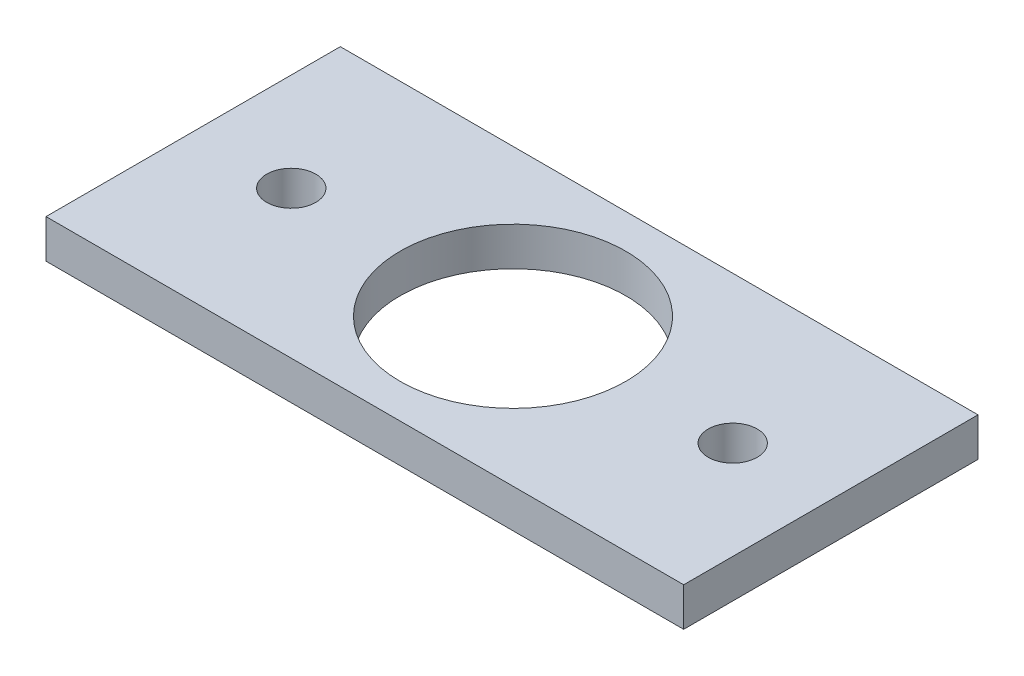
ISO-10303-21;
HEADER;
FILE_DESCRIPTION(('STEP AP214'),'2;1');
FILE_NAME('part.step','',(''),(''),'','','');
FILE_SCHEMA(('AUTOMOTIVE_DESIGN { 1 0 10303 214 1 1 1 1 }'));
ENDSEC;
DATA;
#1=APPLICATION_CONTEXT('core data for automotive mechanical design processes');
#2=APPLICATION_PROTOCOL_DEFINITION('international standard','automotive_design',2000,#1);
#3=PRODUCT_CONTEXT('',#1,'mechanical');
#4=PRODUCT('Part','Part','',(#3));
#5=PRODUCT_RELATED_PRODUCT_CATEGORY('part','',(#4));
#6=PRODUCT_DEFINITION_FORMATION('','',#4);
#7=PRODUCT_DEFINITION_CONTEXT('part definition',#1,'design');
#8=PRODUCT_DEFINITION('design','',#6,#7);
#9=PRODUCT_DEFINITION_SHAPE('','',#8);
#10=(LENGTH_UNIT() NAMED_UNIT(*) SI_UNIT(.MILLI.,.METRE.));
#11=(NAMED_UNIT(*) PLANE_ANGLE_UNIT() SI_UNIT($,.RADIAN.));
#12=(NAMED_UNIT(*) SI_UNIT($,.STERADIAN.) SOLID_ANGLE_UNIT());
#13=UNCERTAINTY_MEASURE_WITH_UNIT(LENGTH_MEASURE(1.E-05),#10,'distance_accuracy_value','');
#14=(GEOMETRIC_REPRESENTATION_CONTEXT(3) GLOBAL_UNCERTAINTY_ASSIGNED_CONTEXT((#13)) GLOBAL_UNIT_ASSIGNED_CONTEXT((#10,
#11,#12)) REPRESENTATION_CONTEXT('',''));
#15=CARTESIAN_POINT('',(0.,0.,0.));
#16=DIRECTION('',(0.,0.,1.));
#17=DIRECTION('',(1.,0.,0.));
#18=AXIS2_PLACEMENT_3D('',#15,#16,#17);
#19=CARTESIAN_POINT('',(0.,5.,0.));
#20=DIRECTION('',(0.,1.,0.));
#21=DIRECTION('',(0.,0.,1.));
#22=AXIS2_PLACEMENT_3D('',#19,#20,#21);
#23=PLANE('',#22);
#24=CARTESIAN_POINT('',(28.448,5.,0.));
#25=DIRECTION('',(0.,1.,0.));
#26=DIRECTION('',(0.,0.,1.));
#27=AXIS2_PLACEMENT_3D('',#24,#25,#26);
#28=CIRCLE('',#27,3.175);
#29=CARTESIAN_POINT('',(28.448,5.,3.17499999999999));
#30=VERTEX_POINT('',#29);
#31=EDGE_CURVE('E134',#30,#30,#28,.T.);
#32=ORIENTED_EDGE('',*,*,#31,.F.);
#33=EDGE_LOOP('',(#32));
#34=FACE_BOUND('',#33,.T.);
#35=DIRECTION('',(0.,0.,1.));
#36=VECTOR('',#35,1.);
#37=CARTESIAN_POINT('',(-41.402,5.,-19.05));
#38=LINE('',#37,#36);
#39=CARTESIAN_POINT('',(-41.402,5.,-19.05));
#40=VERTEX_POINT('',#39);
#41=CARTESIAN_POINT('',(-41.402,5.,19.05));
#42=VERTEX_POINT('',#41);
#43=EDGE_CURVE('E92',#40,#42,#38,.T.);
#44=ORIENTED_EDGE('',*,*,#43,.T.);
#45=DIRECTION('',(1.,0.,0.));
#46=VECTOR('',#45,1.);
#47=CARTESIAN_POINT('',(-41.402,5.,19.05));
#48=LINE('',#47,#46);
#49=CARTESIAN_POINT('',(41.148,5.,19.05));
#50=VERTEX_POINT('',#49);
#51=EDGE_CURVE('E87',#42,#50,#48,.T.);
#52=ORIENTED_EDGE('',*,*,#51,.T.);
#53=DIRECTION('',(0.,0.,-1.));
#54=VECTOR('',#53,1.);
#55=CARTESIAN_POINT('',(41.148,5.,-19.05));
#56=LINE('',#55,#54);
#57=CARTESIAN_POINT('',(41.148,5.,-19.05));
#58=VERTEX_POINT('',#57);
#59=EDGE_CURVE('E90',#50,#58,#56,.T.);
#60=ORIENTED_EDGE('',*,*,#59,.T.);
#61=DIRECTION('',(-1.,0.,0.));
#62=VECTOR('',#61,1.);
#63=CARTESIAN_POINT('',(-41.402,5.,-19.05));
#64=LINE('',#63,#62);
#65=EDGE_CURVE('E57',#58,#40,#64,.T.);
#66=ORIENTED_EDGE('',*,*,#65,.T.);
#67=EDGE_LOOP('',(#44,#52,#60,#66));
#68=FACE_BOUND('',#67,.T.);
#69=CARTESIAN_POINT('',(0.,5.,0.));
#70=DIRECTION('',(0.,1.,0.));
#71=DIRECTION('',(0.,0.,1.));
#72=AXIS2_PLACEMENT_3D('',#69,#70,#71);
#73=CIRCLE('',#72,14.605);
#74=CARTESIAN_POINT('',(0.,5.,14.605));
#75=VERTEX_POINT('',#74);
#76=EDGE_CURVE('E112',#75,#75,#73,.T.);
#77=ORIENTED_EDGE('',*,*,#76,.F.);
#78=EDGE_LOOP('',(#77));
#79=FACE_BOUND('',#78,.T.);
#80=CARTESIAN_POINT('',(-28.702,5.,0.));
#81=DIRECTION('',(0.,1.,0.));
#82=DIRECTION('',(0.,0.,1.));
#83=AXIS2_PLACEMENT_3D('',#80,#81,#82);
#84=CIRCLE('',#83,3.175);
#85=CARTESIAN_POINT('',(-28.702,5.,3.17500000000001));
#86=VERTEX_POINT('',#85);
#87=EDGE_CURVE('E142',#86,#86,#84,.T.);
#88=ORIENTED_EDGE('',*,*,#87,.F.);
#89=EDGE_LOOP('',(#88));
#90=FACE_BOUND('',#89,.T.);
#91=ADVANCED_FACE('F39',(#34,#68,#79,#90),#23,.T.);
#92=CARTESIAN_POINT('',(0.,0.,0.));
#93=DIRECTION('',(0.,1.,0.));
#94=DIRECTION('',(0.,0.,1.));
#95=AXIS2_PLACEMENT_3D('',#92,#93,#94);
#96=PLANE('',#95);
#97=DIRECTION('',(0.,0.,1.));
#98=VECTOR('',#97,1.);
#99=CARTESIAN_POINT('',(-41.402,0.,-19.05));
#100=LINE('',#99,#98);
#101=CARTESIAN_POINT('',(-41.402,0.,-19.05));
#102=VERTEX_POINT('',#101);
#103=CARTESIAN_POINT('',(-41.402,0.,19.05));
#104=VERTEX_POINT('',#103);
#105=EDGE_CURVE('E108',#102,#104,#100,.T.);
#106=ORIENTED_EDGE('',*,*,#105,.F.);
#107=DIRECTION('',(-1.,0.,0.));
#108=VECTOR('',#107,1.);
#109=CARTESIAN_POINT('',(-41.402,0.,-19.05));
#110=LINE('',#109,#108);
#111=CARTESIAN_POINT('',(41.148,0.,-19.05));
#112=VERTEX_POINT('',#111);
#113=EDGE_CURVE('E80',#112,#102,#110,.T.);
#114=ORIENTED_EDGE('',*,*,#113,.F.);
#115=DIRECTION('',(0.,0.,-1.));
#116=VECTOR('',#115,1.);
#117=CARTESIAN_POINT('',(41.148,0.,-19.05));
#118=LINE('',#117,#116);
#119=CARTESIAN_POINT('',(41.148,0.,19.05));
#120=VERTEX_POINT('',#119);
#121=EDGE_CURVE('E74',#120,#112,#118,.T.);
#122=ORIENTED_EDGE('',*,*,#121,.F.);
#123=DIRECTION('',(1.,0.,0.));
#124=VECTOR('',#123,1.);
#125=CARTESIAN_POINT('',(-41.402,0.,19.05));
#126=LINE('',#125,#124);
#127=EDGE_CURVE('E97',#104,#120,#126,.T.);
#128=ORIENTED_EDGE('',*,*,#127,.F.);
#129=EDGE_LOOP('',(#106,#114,#122,#128));
#130=FACE_BOUND('',#129,.T.);
#131=CARTESIAN_POINT('',(0.,0.,0.));
#132=DIRECTION('',(0.,1.,0.));
#133=DIRECTION('',(0.,0.,1.));
#134=AXIS2_PLACEMENT_3D('',#131,#132,#133);
#135=CIRCLE('',#134,14.605);
#136=CARTESIAN_POINT('',(0.,0.,14.605));
#137=VERTEX_POINT('',#136);
#138=EDGE_CURVE('E130',#137,#137,#135,.T.);
#139=ORIENTED_EDGE('',*,*,#138,.T.);
#140=EDGE_LOOP('',(#139));
#141=FACE_BOUND('',#140,.T.);
#142=CARTESIAN_POINT('',(28.448,0.,0.));
#143=DIRECTION('',(0.,1.,0.));
#144=DIRECTION('',(0.,0.,1.));
#145=AXIS2_PLACEMENT_3D('',#142,#143,#144);
#146=CIRCLE('',#145,3.175);
#147=CARTESIAN_POINT('',(28.448,0.,3.17499999999999));
#148=VERTEX_POINT('',#147);
#149=EDGE_CURVE('E138',#148,#148,#146,.T.);
#150=ORIENTED_EDGE('',*,*,#149,.T.);
#151=EDGE_LOOP('',(#150));
#152=FACE_BOUND('',#151,.T.);
#153=CARTESIAN_POINT('',(-28.702,0.,0.));
#154=DIRECTION('',(0.,1.,0.));
#155=DIRECTION('',(0.,0.,1.));
#156=AXIS2_PLACEMENT_3D('',#153,#154,#155);
#157=CIRCLE('',#156,3.175);
#158=CARTESIAN_POINT('',(-28.702,0.,3.17500000000001));
#159=VERTEX_POINT('',#158);
#160=EDGE_CURVE('E146',#159,#159,#157,.T.);
#161=ORIENTED_EDGE('',*,*,#160,.T.);
#162=EDGE_LOOP('',(#161));
#163=FACE_BOUND('',#162,.T.);
#164=ADVANCED_FACE('F125',(#130,#141,#152,#163),#96,.F.);
#165=CARTESIAN_POINT('',(-41.402,5.,-19.05));
#166=DIRECTION('',(1.,0.,0.));
#167=DIRECTION('',(0.,0.,-1.));
#168=AXIS2_PLACEMENT_3D('',#165,#166,#167);
#169=PLANE('',#168);
#170=ORIENTED_EDGE('',*,*,#105,.T.);
#171=DIRECTION('',(0.,-1.,0.));
#172=VECTOR('',#171,1.);
#173=CARTESIAN_POINT('',(-41.402,5.,19.05));
#174=LINE('',#173,#172);
#175=EDGE_CURVE('E11',#42,#104,#174,.T.);
#176=ORIENTED_EDGE('',*,*,#175,.F.);
#177=ORIENTED_EDGE('',*,*,#43,.F.);
#178=DIRECTION('',(0.,-1.,0.));
#179=VECTOR('',#178,1.);
#180=CARTESIAN_POINT('',(-41.402,5.,-19.05));
#181=LINE('',#180,#179);
#182=EDGE_CURVE('E104',#40,#102,#181,.T.);
#183=ORIENTED_EDGE('',*,*,#182,.T.);
#184=EDGE_LOOP('',(#170,#176,#177,#183));
#185=FACE_BOUND('',#184,.T.);
#186=ADVANCED_FACE('F41',(#185),#169,.F.);
#187=CARTESIAN_POINT('',(-41.402,5.,19.05));
#188=DIRECTION('',(0.,0.,-1.));
#189=DIRECTION('',(-1.,0.,0.));
#190=AXIS2_PLACEMENT_3D('',#187,#188,#189);
#191=PLANE('',#190);
#192=ORIENTED_EDGE('',*,*,#127,.T.);
#193=DIRECTION('',(0.,-1.,0.));
#194=VECTOR('',#193,1.);
#195=CARTESIAN_POINT('',(41.148,5.,19.05));
#196=LINE('',#195,#194);
#197=EDGE_CURVE('E49',#50,#120,#196,.T.);
#198=ORIENTED_EDGE('',*,*,#197,.F.);
#199=ORIENTED_EDGE('',*,*,#51,.F.);
#200=ORIENTED_EDGE('',*,*,#175,.T.);
#201=EDGE_LOOP('',(#192,#198,#199,#200));
#202=FACE_BOUND('',#201,.T.);
#203=ADVANCED_FACE('F96',(#202),#191,.F.);
#204=CARTESIAN_POINT('',(41.148,5.,-19.05));
#205=DIRECTION('',(-1.,0.,0.));
#206=DIRECTION('',(0.,0.,1.));
#207=AXIS2_PLACEMENT_3D('',#204,#205,#206);
#208=PLANE('',#207);
#209=ORIENTED_EDGE('',*,*,#121,.T.);
#210=DIRECTION('',(0.,-1.,0.));
#211=VECTOR('',#210,1.);
#212=CARTESIAN_POINT('',(41.148,5.,-19.05));
#213=LINE('',#212,#211);
#214=EDGE_CURVE('E99',#58,#112,#213,.T.);
#215=ORIENTED_EDGE('',*,*,#214,.F.);
#216=ORIENTED_EDGE('',*,*,#59,.F.);
#217=ORIENTED_EDGE('',*,*,#197,.T.);
#218=EDGE_LOOP('',(#209,#215,#216,#217));
#219=FACE_BOUND('',#218,.T.);
#220=ADVANCED_FACE('F100',(#219),#208,.F.);
#221=CARTESIAN_POINT('',(-41.402,5.,-19.05));
#222=DIRECTION('',(0.,0.,1.));
#223=DIRECTION('',(1.,0.,0.));
#224=AXIS2_PLACEMENT_3D('',#221,#222,#223);
#225=PLANE('',#224);
#226=ORIENTED_EDGE('',*,*,#113,.T.);
#227=ORIENTED_EDGE('',*,*,#182,.F.);
#228=ORIENTED_EDGE('',*,*,#65,.F.);
#229=ORIENTED_EDGE('',*,*,#214,.T.);
#230=EDGE_LOOP('',(#226,#227,#228,#229));
#231=FACE_BOUND('',#230,.T.);
#232=ADVANCED_FACE('F122',(#231),#225,.F.);
#233=CARTESIAN_POINT('',(0.,5.,0.));
#234=DIRECTION('',(0.,-1.,0.));
#235=DIRECTION('',(0.,0.,-1.));
#236=AXIS2_PLACEMENT_3D('',#233,#234,#235);
#237=CYLINDRICAL_SURFACE('',#236,14.605);
#238=ORIENTED_EDGE('',*,*,#76,.T.);
#239=EDGE_LOOP('',(#238));
#240=FACE_BOUND('',#239,.T.);
#241=ORIENTED_EDGE('',*,*,#138,.F.);
#242=EDGE_LOOP('',(#241));
#243=FACE_BOUND('',#242,.T.);
#244=ADVANCED_FACE('F166',(#240,#243),#237,.F.);
#245=CARTESIAN_POINT('',(28.448,5.,0.));
#246=DIRECTION('',(0.,-1.,0.));
#247=DIRECTION('',(0.,0.,-1.));
#248=AXIS2_PLACEMENT_3D('',#245,#246,#247);
#249=CYLINDRICAL_SURFACE('',#248,3.175);
#250=ORIENTED_EDGE('',*,*,#31,.T.);
#251=EDGE_LOOP('',(#250));
#252=FACE_BOUND('',#251,.T.);
#253=ORIENTED_EDGE('',*,*,#149,.F.);
#254=EDGE_LOOP('',(#253));
#255=FACE_BOUND('',#254,.T.);
#256=ADVANCED_FACE('F212',(#252,#255),#249,.F.);
#257=CARTESIAN_POINT('',(-28.702,5.,0.));
#258=DIRECTION('',(0.,-1.,0.));
#259=DIRECTION('',(0.,0.,-1.));
#260=AXIS2_PLACEMENT_3D('',#257,#258,#259);
#261=CYLINDRICAL_SURFACE('',#260,3.175);
#262=ORIENTED_EDGE('',*,*,#87,.T.);
#263=EDGE_LOOP('',(#262));
#264=FACE_BOUND('',#263,.T.);
#265=ORIENTED_EDGE('',*,*,#160,.F.);
#266=EDGE_LOOP('',(#265));
#267=FACE_BOUND('',#266,.T.);
#268=ADVANCED_FACE('F154',(#264,#267),#261,.F.);
#269=CLOSED_SHELL('',(#91,#164,#186,#203,#220,#232,#244,#256,#268));
#270=MANIFOLD_SOLID_BREP('B2',#269);
#271=ADVANCED_BREP_SHAPE_REPRESENTATION('',(#18,#270),#14);
#272=SHAPE_DEFINITION_REPRESENTATION(#9,#271);
ENDSEC;
END-ISO-10303-21;
